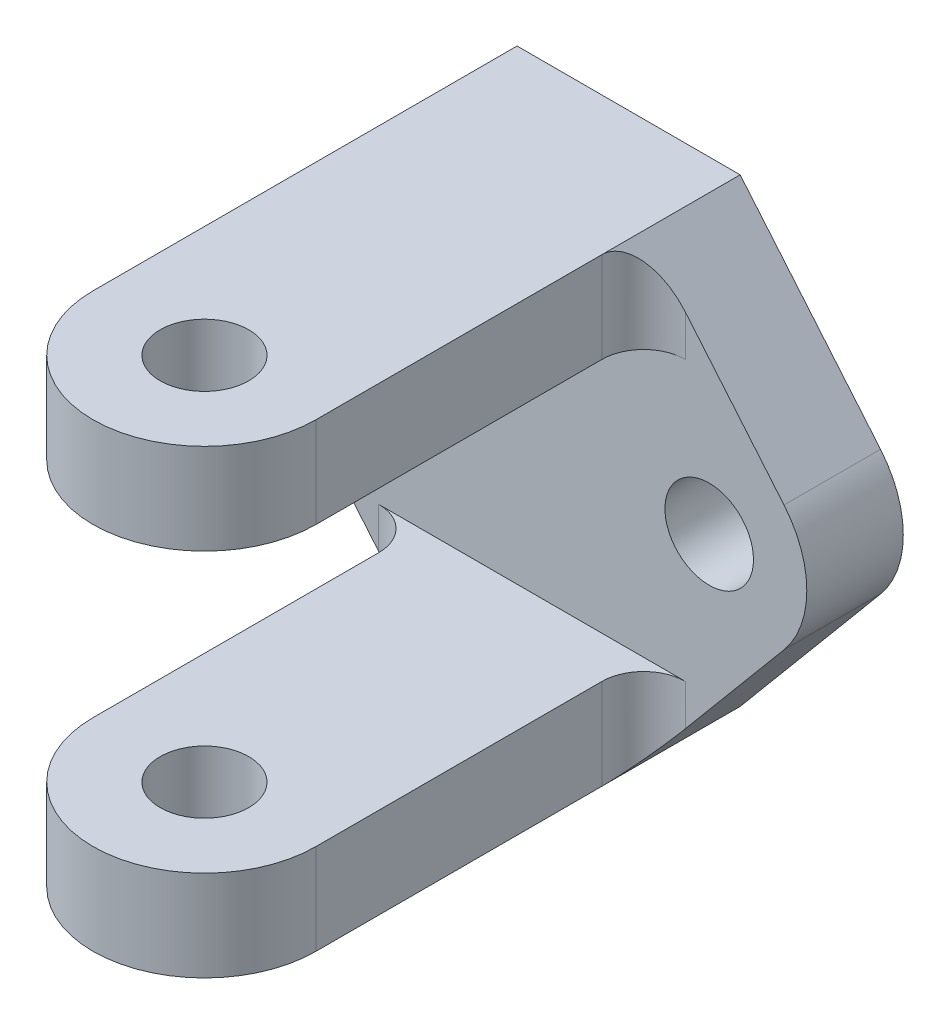
ISO-10303-21;
HEADER;
FILE_DESCRIPTION(('STEP AP214'),'2;1');
FILE_NAME('part.step','',(''),(''),'','','');
FILE_SCHEMA(('AUTOMOTIVE_DESIGN { 1 0 10303 214 1 1 1 1 }'));
ENDSEC;
DATA;
#1=APPLICATION_CONTEXT('core data for automotive mechanical design processes');
#2=APPLICATION_PROTOCOL_DEFINITION('international standard','automotive_design',2000,#1);
#3=PRODUCT_CONTEXT('',#1,'mechanical');
#4=PRODUCT('Part','Part','',(#3));
#5=PRODUCT_RELATED_PRODUCT_CATEGORY('part','',(#4));
#6=PRODUCT_DEFINITION_FORMATION('','',#4);
#7=PRODUCT_DEFINITION_CONTEXT('part definition',#1,'design');
#8=PRODUCT_DEFINITION('design','',#6,#7);
#9=PRODUCT_DEFINITION_SHAPE('','',#8);
#10=(LENGTH_UNIT() NAMED_UNIT(*) SI_UNIT(.MILLI.,.METRE.));
#11=(NAMED_UNIT(*) PLANE_ANGLE_UNIT() SI_UNIT($,.RADIAN.));
#12=(NAMED_UNIT(*) SI_UNIT($,.STERADIAN.) SOLID_ANGLE_UNIT());
#13=UNCERTAINTY_MEASURE_WITH_UNIT(LENGTH_MEASURE(1.E-05),#10,'distance_accuracy_value','');
#14=(GEOMETRIC_REPRESENTATION_CONTEXT(3) GLOBAL_UNCERTAINTY_ASSIGNED_CONTEXT((#13)) GLOBAL_UNIT_ASSIGNED_CONTEXT((#10,
#11,#12)) REPRESENTATION_CONTEXT('',''));
#15=CARTESIAN_POINT('',(0.,0.,0.));
#16=DIRECTION('',(0.,0.,1.));
#17=DIRECTION('',(1.,0.,0.));
#18=AXIS2_PLACEMENT_3D('',#15,#16,#17);
#19=CARTESIAN_POINT('',(-8.,-83.7629553253982,20.));
#20=DIRECTION('',(1.,0.,0.));
#21=DIRECTION('',(0.,0.,-1.));
#22=AXIS2_PLACEMENT_3D('',#19,#20,#21);
#23=PLANE('',#22);
#24=DIRECTION('',(0.,0.,1.));
#25=VECTOR('',#24,1.);
#26=CARTESIAN_POINT('',(-8.,16.51,20.));
#27=LINE('',#26,#25);
#28=CARTESIAN_POINT('',(-8.,16.51,15.));
#29=VERTEX_POINT('',#28);
#30=CARTESIAN_POINT('',(-8.,16.51,35.5));
#31=VERTEX_POINT('',#30);
#32=EDGE_CURVE('E221',#29,#31,#27,.T.);
#33=ORIENTED_EDGE('',*,*,#32,.F.);
#34=DIRECTION('',(0.,1.,0.));
#35=VECTOR('',#34,1.);
#36=CARTESIAN_POINT('',(-8.,9.99999999999999,15.));
#37=LINE('',#36,#35);
#38=CARTESIAN_POINT('',(-8.,10.,15.));
#39=VERTEX_POINT('',#38);
#40=EDGE_CURVE('E323',#29,#39,#37,.F.);
#41=ORIENTED_EDGE('',*,*,#40,.T.);
#42=DIRECTION('',(0.,0.,-1.));
#43=VECTOR('',#42,1.);
#44=CARTESIAN_POINT('',(-8.,10.,65.));
#45=LINE('',#44,#43);
#46=CARTESIAN_POINT('',(-8.,9.99999999999999,35.5));
#47=VERTEX_POINT('',#46);
#48=EDGE_CURVE('E263',#47,#39,#45,.T.);
#49=ORIENTED_EDGE('',*,*,#48,.F.);
#50=DIRECTION('',(0.,1.,0.));
#51=VECTOR('',#50,1.);
#52=CARTESIAN_POINT('',(-8.,-83.7629553253982,35.5));
#53=LINE('',#52,#51);
#54=EDGE_CURVE('E252',#47,#31,#53,.T.);
#55=ORIENTED_EDGE('',*,*,#54,.T.);
#56=EDGE_LOOP('',(#33,#41,#49,#55));
#57=FACE_BOUND('',#56,.T.);
#58=ADVANCED_FACE('F44',(#57),#23,.F.);
#59=CARTESIAN_POINT('',(8.,-83.7629553253982,35.5));
#60=DIRECTION('',(-1.,0.,0.));
#61=DIRECTION('',(0.,0.,1.));
#62=AXIS2_PLACEMENT_3D('',#59,#60,#61);
#63=PLANE('',#62);
#64=DIRECTION('',(0.,0.,1.));
#65=VECTOR('',#64,1.);
#66=CARTESIAN_POINT('',(8.,10.,65.));
#67=LINE('',#66,#65);
#68=CARTESIAN_POINT('',(8.,10.,15.));
#69=VERTEX_POINT('',#68);
#70=CARTESIAN_POINT('',(8.,9.99999999999999,35.5));
#71=VERTEX_POINT('',#70);
#72=EDGE_CURVE('E248',#69,#71,#67,.T.);
#73=ORIENTED_EDGE('',*,*,#72,.F.);
#74=DIRECTION('',(0.,1.,0.));
#75=VECTOR('',#74,1.);
#76=CARTESIAN_POINT('',(8.,16.51,15.));
#77=LINE('',#76,#75);
#78=CARTESIAN_POINT('',(8.,16.51,15.));
#79=VERTEX_POINT('',#78);
#80=EDGE_CURVE('E332',#69,#79,#77,.T.);
#81=ORIENTED_EDGE('',*,*,#80,.T.);
#82=DIRECTION('',(0.,0.,-1.));
#83=VECTOR('',#82,1.);
#84=CARTESIAN_POINT('',(8.,16.51,35.5));
#85=LINE('',#84,#83);
#86=CARTESIAN_POINT('',(8.,16.51,35.5));
#87=VERTEX_POINT('',#86);
#88=EDGE_CURVE('E232',#87,#79,#85,.T.);
#89=ORIENTED_EDGE('',*,*,#88,.F.);
#90=DIRECTION('',(0.,1.,0.));
#91=VECTOR('',#90,1.);
#92=CARTESIAN_POINT('',(8.,-83.7629553253982,35.5));
#93=LINE('',#92,#91);
#94=EDGE_CURVE('E236',#71,#87,#93,.T.);
#95=ORIENTED_EDGE('',*,*,#94,.F.);
#96=EDGE_LOOP('',(#73,#81,#89,#95));
#97=FACE_BOUND('',#96,.T.);
#98=ADVANCED_FACE('F381',(#97),#63,.F.);
#99=CARTESIAN_POINT('',(12.7,0.,47.3781062240477));
#100=DIRECTION('',(0.,0.,-1.));
#101=DIRECTION('',(-1.,0.,0.));
#102=AXIS2_PLACEMENT_3D('',#99,#100,#101);
#103=CYLINDRICAL_SURFACE('',#102,7.);
#104=CARTESIAN_POINT('',(12.7,0.,5.08));
#105=DIRECTION('',(0.,0.,1.));
#106=DIRECTION('',(1.,0.,0.));
#107=AXIS2_PLACEMENT_3D('',#104,#105,#106);
#108=CIRCLE('',#107,7.00000000000001);
#109=CARTESIAN_POINT('',(18.0657591468047,-4.49540084736414,5.08));
#110=VERTEX_POINT('',#109);
#111=CARTESIAN_POINT('',(18.0657591468047,4.49540084736415,5.08));
#112=VERTEX_POINT('',#111);
#113=EDGE_CURVE('E489',#110,#112,#108,.T.);
#114=ORIENTED_EDGE('',*,*,#113,.T.);
#115=DIRECTION('',(0.,0.,-1.));
#116=VECTOR('',#115,1.);
#117=CARTESIAN_POINT('',(18.0657591468047,4.49540084736414,27.6738667851937));
#118=LINE('',#117,#116);
#119=CARTESIAN_POINT('',(18.0657591468047,4.49540084736414,12.));
#120=VERTEX_POINT('',#119);
#121=EDGE_CURVE('E373',#120,#112,#118,.T.);
#122=ORIENTED_EDGE('',*,*,#121,.F.);
#123=CARTESIAN_POINT('',(12.7,0.,12.));
#124=DIRECTION('',(0.,0.,-1.));
#125=DIRECTION('',(-1.,0.,0.));
#126=AXIS2_PLACEMENT_3D('',#123,#124,#125);
#127=CIRCLE('',#126,7.);
#128=CARTESIAN_POINT('',(18.0657591468046,-4.49540084736413,12.));
#129=VERTEX_POINT('',#128);
#130=EDGE_CURVE('E213',#129,#120,#127,.F.);
#131=ORIENTED_EDGE('',*,*,#130,.F.);
#132=DIRECTION('',(0.,0.,-1.));
#133=VECTOR('',#132,1.);
#134=CARTESIAN_POINT('',(18.0657591468047,-4.49540084736414,27.6738667851937));
#135=LINE('',#134,#133);
#136=EDGE_CURVE('E204',#129,#110,#135,.T.);
#137=ORIENTED_EDGE('',*,*,#136,.T.);
#138=EDGE_LOOP('',(#114,#122,#131,#137));
#139=FACE_BOUND('',#138,.T.);
#140=ADVANCED_FACE('F417',(#139),#103,.T.);
#141=DIRECTION('',(0.,0.,1.));
#142=VECTOR('',#141,1.);
#143=CARTESIAN_POINT('',(-8.,-10.,65.));
#144=LINE('',#143,#142);
#145=CARTESIAN_POINT('',(-8.,-10.,15.));
#146=VERTEX_POINT('',#145);
#147=CARTESIAN_POINT('',(-8.,-9.99999999999999,35.5));
#148=VERTEX_POINT('',#147);
#149=EDGE_CURVE('E304',#146,#148,#144,.T.);
#150=ORIENTED_EDGE('',*,*,#149,.F.);
#151=DIRECTION('',(0.,-1.,0.));
#152=VECTOR('',#151,1.);
#153=CARTESIAN_POINT('',(-8.,-16.51,15.));
#154=LINE('',#153,#152);
#155=CARTESIAN_POINT('',(-8.,-16.51,15.));
#156=VERTEX_POINT('',#155);
#157=EDGE_CURVE('E326',#146,#156,#154,.T.);
#158=ORIENTED_EDGE('',*,*,#157,.T.);
#159=DIRECTION('',(0.,0.,1.));
#160=VECTOR('',#159,1.);
#161=CARTESIAN_POINT('',(-8.,-16.51,20.));
#162=LINE('',#161,#160);
#163=CARTESIAN_POINT('',(-8.,-16.51,35.5));
#164=VERTEX_POINT('',#163);
#165=EDGE_CURVE('E244',#156,#164,#162,.T.);
#166=ORIENTED_EDGE('',*,*,#165,.T.);
#167=EDGE_CURVE('E241',#164,#148,#53,.T.);
#168=ORIENTED_EDGE('',*,*,#167,.T.);
#169=EDGE_LOOP('',(#150,#158,#166,#168));
#170=FACE_BOUND('',#169,.T.);
#171=ADVANCED_FACE('F413',(#170),#23,.F.);
#172=CARTESIAN_POINT('',(-12.7,0.,47.3781062240477));
#173=DIRECTION('',(0.,0.,-1.));
#174=DIRECTION('',(-1.,0.,0.));
#175=AXIS2_PLACEMENT_3D('',#172,#173,#174);
#176=CYLINDRICAL_SURFACE('',#175,7.);
#177=DIRECTION('',(0.,0.,-1.));
#178=VECTOR('',#177,1.);
#179=CARTESIAN_POINT('',(-18.0657591468047,4.49540084736414,27.6738667851937));
#180=LINE('',#179,#178);
#181=CARTESIAN_POINT('',(-18.0657591468047,4.49540084736414,12.));
#182=VERTEX_POINT('',#181);
#183=CARTESIAN_POINT('',(-18.0657591468047,4.49540084736414,5.08000000000001));
#184=VERTEX_POINT('',#183);
#185=EDGE_CURVE('E193',#182,#184,#180,.T.);
#186=ORIENTED_EDGE('',*,*,#185,.T.);
#187=CARTESIAN_POINT('',(-12.7,0.,5.08));
#188=DIRECTION('',(0.,0.,1.));
#189=DIRECTION('',(1.,0.,0.));
#190=AXIS2_PLACEMENT_3D('',#187,#188,#189);
#191=CIRCLE('',#190,7.);
#192=CARTESIAN_POINT('',(-18.0657591468046,-4.49540084736414,5.08));
#193=VERTEX_POINT('',#192);
#194=EDGE_CURVE('E60',#184,#193,#191,.T.);
#195=ORIENTED_EDGE('',*,*,#194,.T.);
#196=DIRECTION('',(0.,0.,-1.));
#197=VECTOR('',#196,1.);
#198=CARTESIAN_POINT('',(-18.0657591468046,-4.49540084736414,27.6738667851937));
#199=LINE('',#198,#197);
#200=CARTESIAN_POINT('',(-18.0657591468047,-4.49540084736414,12.));
#201=VERTEX_POINT('',#200);
#202=EDGE_CURVE('E190',#201,#193,#199,.T.);
#203=ORIENTED_EDGE('',*,*,#202,.F.);
#204=CARTESIAN_POINT('',(-12.7,0.,12.));
#205=DIRECTION('',(0.,0.,-1.));
#206=DIRECTION('',(-1.,0.,0.));
#207=AXIS2_PLACEMENT_3D('',#204,#205,#206);
#208=CIRCLE('',#207,7.);
#209=EDGE_CURVE('E218',#201,#182,#208,.T.);
#210=ORIENTED_EDGE('',*,*,#209,.T.);
#211=EDGE_LOOP('',(#186,#195,#203,#210));
#212=FACE_BOUND('',#211,.T.);
#213=ADVANCED_FACE('F188',(#212),#176,.T.);
#214=DIRECTION('',(0.,0.,-1.));
#215=VECTOR('',#214,1.);
#216=CARTESIAN_POINT('',(8.,-16.51,35.5));
#217=LINE('',#216,#215);
#218=CARTESIAN_POINT('',(8.,-16.51,35.5));
#219=VERTEX_POINT('',#218);
#220=CARTESIAN_POINT('',(8.,-16.51,15.));
#221=VERTEX_POINT('',#220);
#222=EDGE_CURVE('E237',#219,#221,#217,.T.);
#223=ORIENTED_EDGE('',*,*,#222,.T.);
#224=DIRECTION('',(0.,-1.,0.));
#225=VECTOR('',#224,1.);
#226=CARTESIAN_POINT('',(8.,-9.99999999999999,15.));
#227=LINE('',#226,#225);
#228=CARTESIAN_POINT('',(8.,-9.99999999999999,15.));
#229=VERTEX_POINT('',#228);
#230=EDGE_CURVE('E92',#221,#229,#227,.F.);
#231=ORIENTED_EDGE('',*,*,#230,.T.);
#232=DIRECTION('',(0.,0.,-1.));
#233=VECTOR('',#232,1.);
#234=CARTESIAN_POINT('',(8.,-9.99999999999999,65.));
#235=LINE('',#234,#233);
#236=CARTESIAN_POINT('',(8.,-9.99999999999999,35.5));
#237=VERTEX_POINT('',#236);
#238=EDGE_CURVE('E294',#237,#229,#235,.T.);
#239=ORIENTED_EDGE('',*,*,#238,.F.);
#240=EDGE_CURVE('E253',#219,#237,#93,.T.);
#241=ORIENTED_EDGE('',*,*,#240,.F.);
#242=EDGE_LOOP('',(#223,#231,#239,#241));
#243=FACE_BOUND('',#242,.T.);
#244=ADVANCED_FACE('F418',(#243),#63,.F.);
#245=CARTESIAN_POINT('',(0.,0.,12.));
#246=DIRECTION('',(0.,0.,-1.));
#247=DIRECTION('',(-1.,0.,0.));
#248=AXIS2_PLACEMENT_3D('',#245,#246,#247);
#249=PLANE('',#248);
#250=DIRECTION('',(1.,0.,0.));
#251=VECTOR('',#250,1.);
#252=CARTESIAN_POINT('',(-20.7,10.,12.));
#253=LINE('',#252,#251);
#254=CARTESIAN_POINT('',(-11.,10.,12.));
#255=VERTEX_POINT('',#254);
#256=CARTESIAN_POINT('',(11.,10.,12.));
#257=VERTEX_POINT('',#256);
#258=EDGE_CURVE('E283',#255,#257,#253,.T.);
#259=ORIENTED_EDGE('',*,*,#258,.F.);
#260=DIRECTION('',(0.,1.,0.));
#261=VECTOR('',#260,1.);
#262=CARTESIAN_POINT('',(-11.,16.51,12.));
#263=LINE('',#262,#261);
#264=CARTESIAN_POINT('',(-11.,12.9291675031933,12.));
#265=VERTEX_POINT('',#264);
#266=EDGE_CURVE('E319',#255,#265,#263,.T.);
#267=ORIENTED_EDGE('',*,*,#266,.T.);
#268=DIRECTION('',(0.64220012105202,0.766537020972093,0.));
#269=VECTOR('',#268,1.);
#270=CARTESIAN_POINT('',(-8.,16.51,12.));
#271=LINE('',#270,#269);
#272=EDGE_CURVE('E442',#182,#265,#271,.T.);
#273=ORIENTED_EDGE('',*,*,#272,.F.);
#274=ORIENTED_EDGE('',*,*,#209,.F.);
#275=DIRECTION('',(0.64220012105202,-0.766537020972093,0.));
#276=VECTOR('',#275,1.);
#277=CARTESIAN_POINT('',(-12.8280125042184,-10.7472319766351,12.));
#278=LINE('',#277,#276);
#279=CARTESIAN_POINT('',(-11.,-12.9291675031933,12.));
#280=VERTEX_POINT('',#279);
#281=EDGE_CURVE('E199',#201,#280,#278,.T.);
#282=ORIENTED_EDGE('',*,*,#281,.T.);
#283=DIRECTION('',(0.,-1.,0.));
#284=VECTOR('',#283,1.);
#285=CARTESIAN_POINT('',(-11.,-9.99999999999999,12.));
#286=LINE('',#285,#284);
#287=CARTESIAN_POINT('',(-11.,-10.,12.));
#288=VERTEX_POINT('',#287);
#289=EDGE_CURVE('E315',#280,#288,#286,.F.);
#290=ORIENTED_EDGE('',*,*,#289,.T.);
#291=DIRECTION('',(-1.,0.,0.));
#292=VECTOR('',#291,1.);
#293=CARTESIAN_POINT('',(-20.7,-10.,12.));
#294=LINE('',#293,#292);
#295=CARTESIAN_POINT('',(11.,-9.99999999999999,12.));
#296=VERTEX_POINT('',#295);
#297=EDGE_CURVE('E280',#296,#288,#294,.T.);
#298=ORIENTED_EDGE('',*,*,#297,.F.);
#299=DIRECTION('',(0.,-1.,0.));
#300=VECTOR('',#299,1.);
#301=CARTESIAN_POINT('',(11.,-16.51,12.));
#302=LINE('',#301,#300);
#303=CARTESIAN_POINT('',(11.,-12.9291675031933,12.));
#304=VERTEX_POINT('',#303);
#305=EDGE_CURVE('E311',#296,#304,#302,.T.);
#306=ORIENTED_EDGE('',*,*,#305,.T.);
#307=DIRECTION('',(-0.64220012105202,-0.766537020972093,0.));
#308=VECTOR('',#307,1.);
#309=CARTESIAN_POINT('',(12.8280125042185,-10.7472319766351,12.));
#310=LINE('',#309,#308);
#311=EDGE_CURVE('E210',#129,#304,#310,.T.);
#312=ORIENTED_EDGE('',*,*,#311,.F.);
#313=ORIENTED_EDGE('',*,*,#130,.T.);
#314=DIRECTION('',(-0.64220012105202,0.766537020972093,0.));
#315=VECTOR('',#314,1.);
#316=CARTESIAN_POINT('',(8.,16.51,12.));
#317=LINE('',#316,#315);
#318=CARTESIAN_POINT('',(11.,12.9291675031933,12.));
#319=VERTEX_POINT('',#318);
#320=EDGE_CURVE('E362',#120,#319,#317,.T.);
#321=ORIENTED_EDGE('',*,*,#320,.T.);
#322=DIRECTION('',(0.,1.,0.));
#323=VECTOR('',#322,1.);
#324=CARTESIAN_POINT('',(11.,9.99999999999999,12.));
#325=LINE('',#324,#323);
#326=EDGE_CURVE('E307',#319,#257,#325,.F.);
#327=ORIENTED_EDGE('',*,*,#326,.T.);
#328=EDGE_LOOP('',(#259,#267,#273,#274,#282,#290,#298,#306,#312,#313,#321,#327));
#329=FACE_BOUND('',#328,.T.);
#330=CARTESIAN_POINT('',(-12.7,0.,12.));
#331=DIRECTION('',(0.,0.,1.));
#332=DIRECTION('',(1.,0.,0.));
#333=AXIS2_PLACEMENT_3D('',#330,#331,#332);
#334=CIRCLE('',#333,3.175);
#335=CARTESIAN_POINT('',(-9.525,0.,12.));
#336=VERTEX_POINT('',#335);
#337=EDGE_CURVE('E286',#336,#336,#334,.T.);
#338=ORIENTED_EDGE('',*,*,#337,.F.);
#339=EDGE_LOOP('',(#338));
#340=FACE_BOUND('',#339,.T.);
#341=CARTESIAN_POINT('',(12.7,0.,12.));
#342=DIRECTION('',(0.,0.,1.));
#343=DIRECTION('',(1.,0.,0.));
#344=AXIS2_PLACEMENT_3D('',#341,#342,#343);
#345=CIRCLE('',#344,3.175);
#346=CARTESIAN_POINT('',(15.875,0.,12.));
#347=VERTEX_POINT('',#346);
#348=EDGE_CURVE('E290',#347,#347,#345,.T.);
#349=ORIENTED_EDGE('',*,*,#348,.F.);
#350=EDGE_LOOP('',(#349));
#351=FACE_BOUND('',#350,.T.);
#352=ADVANCED_FACE('F367',(#329,#340,#351),#249,.F.);
#353=CARTESIAN_POINT('',(-20.7,16.51,12.));
#354=DIRECTION('',(0.,-1.,0.));
#355=DIRECTION('',(0.,0.,-1.));
#356=AXIS2_PLACEMENT_3D('',#353,#354,#355);
#357=PLANE('',#356);
#358=CARTESIAN_POINT('',(0.,16.51,35.5));
#359=DIRECTION('',(0.,-1.,0.));
#360=DIRECTION('',(0.,0.,-1.));
#361=AXIS2_PLACEMENT_3D('',#358,#359,#360);
#362=CIRCLE('',#361,3.175);
#363=CARTESIAN_POINT('',(0.,16.51,38.675));
#364=VERTEX_POINT('',#363);
#365=EDGE_CURVE('E267',#364,#364,#362,.T.);
#366=ORIENTED_EDGE('',*,*,#365,.T.);
#367=EDGE_LOOP('',(#366));
#368=FACE_BOUND('',#367,.T.);
#369=DIRECTION('',(0.,0.,-1.));
#370=VECTOR('',#369,1.);
#371=CARTESIAN_POINT('',(8.,16.51,27.6738667851937));
#372=LINE('',#371,#370);
#373=CARTESIAN_POINT('',(8.,16.51,5.08));
#374=VERTEX_POINT('',#373);
#375=EDGE_CURVE('E83',#79,#374,#372,.T.);
#376=ORIENTED_EDGE('',*,*,#375,.T.);
#377=DIRECTION('',(-1.,0.,0.));
#378=VECTOR('',#377,1.);
#379=CARTESIAN_POINT('',(8.,16.51,5.08));
#380=LINE('',#379,#378);
#381=CARTESIAN_POINT('',(-8.,16.51,5.08));
#382=VERTEX_POINT('',#381);
#383=EDGE_CURVE('E456',#374,#382,#380,.T.);
#384=ORIENTED_EDGE('',*,*,#383,.T.);
#385=EDGE_CURVE('E225',#382,#29,#27,.T.);
#386=ORIENTED_EDGE('',*,*,#385,.T.);
#387=ORIENTED_EDGE('',*,*,#32,.T.);
#388=CARTESIAN_POINT('',(0.,16.51,35.5));
#389=DIRECTION('',(0.,-1.,0.));
#390=DIRECTION('',(0.,0.,-1.));
#391=AXIS2_PLACEMENT_3D('',#388,#389,#390);
#392=CIRCLE('',#391,8.);
#393=EDGE_CURVE('E228',#31,#87,#392,.F.);
#394=ORIENTED_EDGE('',*,*,#393,.T.);
#395=ORIENTED_EDGE('',*,*,#88,.T.);
#396=EDGE_LOOP('',(#376,#384,#386,#387,#394,#395));
#397=FACE_BOUND('',#396,.T.);
#398=ADVANCED_FACE('F391',(#368,#397),#357,.F.);
#399=CARTESIAN_POINT('',(-20.7,-16.51,12.));
#400=DIRECTION('',(0.,1.,0.));
#401=DIRECTION('',(0.,0.,1.));
#402=AXIS2_PLACEMENT_3D('',#399,#400,#401);
#403=PLANE('',#402);
#404=CARTESIAN_POINT('',(0.,-16.51,35.5));
#405=DIRECTION('',(0.,1.,0.));
#406=DIRECTION('',(0.,0.,1.));
#407=AXIS2_PLACEMENT_3D('',#404,#405,#406);
#408=CIRCLE('',#407,3.175);
#409=CARTESIAN_POINT('',(0.,-16.51,38.675));
#410=VERTEX_POINT('',#409);
#411=EDGE_CURVE('E271',#410,#410,#408,.F.);
#412=ORIENTED_EDGE('',*,*,#411,.F.);
#413=EDGE_LOOP('',(#412));
#414=FACE_BOUND('',#413,.T.);
#415=CARTESIAN_POINT('',(-8.,-16.51,5.08));
#416=VERTEX_POINT('',#415);
#417=EDGE_CURVE('E245',#416,#156,#162,.T.);
#418=ORIENTED_EDGE('',*,*,#417,.F.);
#419=DIRECTION('',(1.,0.,0.));
#420=VECTOR('',#419,1.);
#421=CARTESIAN_POINT('',(-8.,-16.51,5.08));
#422=LINE('',#421,#420);
#423=CARTESIAN_POINT('',(8.,-16.51,5.08));
#424=VERTEX_POINT('',#423);
#425=EDGE_CURVE('E179',#416,#424,#422,.T.);
#426=ORIENTED_EDGE('',*,*,#425,.T.);
#427=DIRECTION('',(0.,0.,-1.));
#428=VECTOR('',#427,1.);
#429=CARTESIAN_POINT('',(8.,-16.51,27.6738667851937));
#430=LINE('',#429,#428);
#431=EDGE_CURVE('E69',#221,#424,#430,.T.);
#432=ORIENTED_EDGE('',*,*,#431,.F.);
#433=ORIENTED_EDGE('',*,*,#222,.F.);
#434=CARTESIAN_POINT('',(0.,-16.51,35.5));
#435=DIRECTION('',(0.,1.,0.));
#436=DIRECTION('',(0.,0.,1.));
#437=AXIS2_PLACEMENT_3D('',#434,#435,#436);
#438=CIRCLE('',#437,8.);
#439=EDGE_CURVE('E240',#164,#219,#438,.T.);
#440=ORIENTED_EDGE('',*,*,#439,.F.);
#441=ORIENTED_EDGE('',*,*,#165,.F.);
#442=EDGE_LOOP('',(#418,#426,#432,#433,#440,#441));
#443=FACE_BOUND('',#442,.T.);
#444=ADVANCED_FACE('F486',(#414,#443),#403,.F.);
#445=CARTESIAN_POINT('',(12.7,0.,12.));
#446=DIRECTION('',(0.,0.,-1.));
#447=DIRECTION('',(-1.,0.,0.));
#448=AXIS2_PLACEMENT_3D('',#445,#446,#447);
#449=CYLINDRICAL_SURFACE('',#448,3.175);
#450=CARTESIAN_POINT('',(12.7,0.,5.08));
#451=DIRECTION('',(0.,0.,1.));
#452=DIRECTION('',(1.,0.,0.));
#453=AXIS2_PLACEMENT_3D('',#450,#451,#452);
#454=CIRCLE('',#453,3.175);
#455=CARTESIAN_POINT('',(15.875,0.,5.08));
#456=VERTEX_POINT('',#455);
#457=EDGE_CURVE('E446',#456,#456,#454,.T.);
#458=ORIENTED_EDGE('',*,*,#457,.F.);
#459=EDGE_LOOP('',(#458));
#460=FACE_BOUND('',#459,.T.);
#461=ORIENTED_EDGE('',*,*,#348,.T.);
#462=EDGE_LOOP('',(#461));
#463=FACE_BOUND('',#462,.T.);
#464=ADVANCED_FACE('F510',(#460,#463),#449,.F.);
#465=CARTESIAN_POINT('',(-12.7,0.,12.));
#466=DIRECTION('',(0.,0.,-1.));
#467=DIRECTION('',(-1.,0.,0.));
#468=AXIS2_PLACEMENT_3D('',#465,#466,#467);
#469=CYLINDRICAL_SURFACE('',#468,3.175);
#470=CARTESIAN_POINT('',(-12.7,0.,5.08));
#471=DIRECTION('',(0.,0.,1.));
#472=DIRECTION('',(1.,0.,0.));
#473=AXIS2_PLACEMENT_3D('',#470,#471,#472);
#474=CIRCLE('',#473,3.175);
#475=CARTESIAN_POINT('',(-9.525,0.,5.08));
#476=VERTEX_POINT('',#475);
#477=EDGE_CURVE('E500',#476,#476,#474,.T.);
#478=ORIENTED_EDGE('',*,*,#477,.F.);
#479=EDGE_LOOP('',(#478));
#480=FACE_BOUND('',#479,.T.);
#481=ORIENTED_EDGE('',*,*,#337,.T.);
#482=EDGE_LOOP('',(#481));
#483=FACE_BOUND('',#482,.T.);
#484=ADVANCED_FACE('F513',(#480,#483),#469,.F.);
#485=CARTESIAN_POINT('',(-20.7,10.,65.));
#486=DIRECTION('',(0.,1.,0.));
#487=DIRECTION('',(0.,0.,1.));
#488=AXIS2_PLACEMENT_3D('',#485,#486,#487);
#489=PLANE('',#488);
#490=CARTESIAN_POINT('',(0.,10.,35.5));
#491=DIRECTION('',(0.,1.,0.));
#492=DIRECTION('',(0.,0.,1.));
#493=AXIS2_PLACEMENT_3D('',#490,#491,#492);
#494=CIRCLE('',#493,3.175);
#495=CARTESIAN_POINT('',(0.,10.,38.675));
#496=VERTEX_POINT('',#495);
#497=EDGE_CURVE('E276',#496,#496,#494,.T.);
#498=ORIENTED_EDGE('',*,*,#497,.T.);
#499=EDGE_LOOP('',(#498));
#500=FACE_BOUND('',#499,.T.);
#501=CARTESIAN_POINT('',(0.,9.99999999999999,35.5));
#502=DIRECTION('',(0.,1.,0.));
#503=DIRECTION('',(0.,0.,1.));
#504=AXIS2_PLACEMENT_3D('',#501,#502,#503);
#505=CIRCLE('',#504,8.);
#506=EDGE_CURVE('E259',#71,#47,#505,.F.);
#507=ORIENTED_EDGE('',*,*,#506,.T.);
#508=ORIENTED_EDGE('',*,*,#48,.T.);
#509=CARTESIAN_POINT('',(-11.,10.,15.));
#510=DIRECTION('',(0.,1.,0.));
#511=DIRECTION('',(0.,0.,1.));
#512=AXIS2_PLACEMENT_3D('',#509,#510,#511);
#513=CIRCLE('',#512,3.);
#514=EDGE_CURVE('E340',#39,#255,#513,.T.);
#515=ORIENTED_EDGE('',*,*,#514,.T.);
#516=ORIENTED_EDGE('',*,*,#258,.T.);
#517=CARTESIAN_POINT('',(11.,9.99999999999999,15.));
#518=DIRECTION('',(0.,1.,0.));
#519=DIRECTION('',(0.,0.,1.));
#520=AXIS2_PLACEMENT_3D('',#517,#518,#519);
#521=CIRCLE('',#520,3.);
#522=EDGE_CURVE('E11',#257,#69,#521,.T.);
#523=ORIENTED_EDGE('',*,*,#522,.T.);
#524=ORIENTED_EDGE('',*,*,#72,.T.);
#525=EDGE_LOOP('',(#507,#508,#515,#516,#523,#524));
#526=FACE_BOUND('',#525,.T.);
#527=ADVANCED_FACE('F377',(#500,#526),#489,.F.);
#528=CARTESIAN_POINT('',(-20.7,-10.,65.));
#529=DIRECTION('',(0.,-1.,0.));
#530=DIRECTION('',(1.,0.,0.));
#531=AXIS2_PLACEMENT_3D('',#528,#529,#530);
#532=PLANE('',#531);
#533=CARTESIAN_POINT('',(0.,-9.99999999999999,35.5));
#534=DIRECTION('',(0.,-1.,0.));
#535=DIRECTION('',(1.,0.,0.));
#536=AXIS2_PLACEMENT_3D('',#533,#534,#535);
#537=CIRCLE('',#536,3.175);
#538=CARTESIAN_POINT('',(0.,-9.99999999999999,38.675));
#539=VERTEX_POINT('',#538);
#540=EDGE_CURVE('E275',#539,#539,#537,.T.);
#541=ORIENTED_EDGE('',*,*,#540,.T.);
#542=EDGE_LOOP('',(#541));
#543=FACE_BOUND('',#542,.T.);
#544=ORIENTED_EDGE('',*,*,#297,.T.);
#545=CARTESIAN_POINT('',(-11.,-10.,15.));
#546=DIRECTION('',(0.,-1.,0.));
#547=DIRECTION('',(1.,0.,0.));
#548=AXIS2_PLACEMENT_3D('',#545,#546,#547);
#549=CIRCLE('',#548,3.);
#550=EDGE_CURVE('E347',#288,#146,#549,.T.);
#551=ORIENTED_EDGE('',*,*,#550,.T.);
#552=ORIENTED_EDGE('',*,*,#149,.T.);
#553=CARTESIAN_POINT('',(0.,-9.99999999999999,35.5));
#554=DIRECTION('',(0.,-1.,0.));
#555=DIRECTION('',(1.,0.,0.));
#556=AXIS2_PLACEMENT_3D('',#553,#554,#555);
#557=CIRCLE('',#556,8.);
#558=EDGE_CURVE('E300',#148,#237,#557,.F.);
#559=ORIENTED_EDGE('',*,*,#558,.T.);
#560=ORIENTED_EDGE('',*,*,#238,.T.);
#561=CARTESIAN_POINT('',(11.,-9.99999999999999,15.));
#562=DIRECTION('',(0.,-1.,0.));
#563=DIRECTION('',(1.,0.,0.));
#564=AXIS2_PLACEMENT_3D('',#561,#562,#563);
#565=CIRCLE('',#564,3.);
#566=EDGE_CURVE('E354',#229,#296,#565,.T.);
#567=ORIENTED_EDGE('',*,*,#566,.T.);
#568=EDGE_LOOP('',(#544,#551,#552,#559,#560,#567));
#569=FACE_BOUND('',#568,.T.);
#570=ADVANCED_FACE('F483',(#543,#569),#532,.F.);
#571=CARTESIAN_POINT('',(0.,-25.4902561210691,35.5));
#572=DIRECTION('',(0.,1.,0.));
#573=DIRECTION('',(0.,0.,1.));
#574=AXIS2_PLACEMENT_3D('',#571,#572,#573);
#575=CYLINDRICAL_SURFACE('',#574,3.175);
#576=CARTESIAN_POINT('',(0.,-16.51,38.675));
#577=CARTESIAN_POINT('',(0.,-16.4421875,38.675));
#578=CARTESIAN_POINT('',(0.,-16.374375,38.675));
#579=CARTESIAN_POINT('',(0.,-16.23875,38.675));
#580=CARTESIAN_POINT('',(0.,-16.1709375,38.675));
#581=CARTESIAN_POINT('',(0.,-16.0353125,38.675));
#582=CARTESIAN_POINT('',(0.,-15.9675,38.675));
#583=CARTESIAN_POINT('',(0.,-15.831875,38.675));
#584=CARTESIAN_POINT('',(0.,-15.7640625,38.675));
#585=CARTESIAN_POINT('',(0.,-15.6284375,38.675));
#586=CARTESIAN_POINT('',(0.,-15.560625,38.675));
#587=CARTESIAN_POINT('',(0.,-15.425,38.675));
#588=CARTESIAN_POINT('',(0.,-15.3571875,38.675));
#589=CARTESIAN_POINT('',(0.,-15.2215625,38.675));
#590=CARTESIAN_POINT('',(0.,-15.15375,38.675));
#591=CARTESIAN_POINT('',(0.,-15.018125,38.675));
#592=CARTESIAN_POINT('',(0.,-14.9503125,38.675));
#593=CARTESIAN_POINT('',(0.,-14.8146875,38.675));
#594=CARTESIAN_POINT('',(0.,-14.746875,38.675));
#595=CARTESIAN_POINT('',(0.,-14.61125,38.675));
#596=CARTESIAN_POINT('',(0.,-14.5434375,38.675));
#597=CARTESIAN_POINT('',(0.,-14.4078125,38.675));
#598=CARTESIAN_POINT('',(0.,-14.34,38.675));
#599=CARTESIAN_POINT('',(0.,-14.204375,38.675));
#600=CARTESIAN_POINT('',(0.,-14.1365625,38.675));
#601=CARTESIAN_POINT('',(0.,-14.0009375,38.675));
#602=CARTESIAN_POINT('',(0.,-13.933125,38.675));
#603=CARTESIAN_POINT('',(0.,-13.7975,38.675));
#604=CARTESIAN_POINT('',(0.,-13.7296875,38.675));
#605=CARTESIAN_POINT('',(0.,-13.5940625,38.675));
#606=CARTESIAN_POINT('',(0.,-13.52625,38.675));
#607=CARTESIAN_POINT('',(0.,-13.390625,38.675));
#608=CARTESIAN_POINT('',(0.,-13.3228125,38.675));
#609=CARTESIAN_POINT('',(0.,-13.1871875,38.675));
#610=CARTESIAN_POINT('',(0.,-13.119375,38.675));
#611=CARTESIAN_POINT('',(0.,-12.98375,38.675));
#612=CARTESIAN_POINT('',(0.,-12.9159375,38.675));
#613=CARTESIAN_POINT('',(0.,-12.7803125,38.675));
#614=CARTESIAN_POINT('',(0.,-12.7125,38.675));
#615=CARTESIAN_POINT('',(0.,-12.576875,38.675));
#616=CARTESIAN_POINT('',(0.,-12.5090625,38.675));
#617=CARTESIAN_POINT('',(0.,-12.3734375,38.675));
#618=CARTESIAN_POINT('',(0.,-12.305625,38.675));
#619=CARTESIAN_POINT('',(0.,-12.17,38.675));
#620=CARTESIAN_POINT('',(0.,-12.1021875,38.675));
#621=CARTESIAN_POINT('',(0.,-11.9665625,38.675));
#622=CARTESIAN_POINT('',(0.,-11.89875,38.675));
#623=CARTESIAN_POINT('',(0.,-11.763125,38.675));
#624=CARTESIAN_POINT('',(0.,-11.6953125,38.675));
#625=CARTESIAN_POINT('',(0.,-11.5596875,38.675));
#626=CARTESIAN_POINT('',(0.,-11.491875,38.675));
#627=CARTESIAN_POINT('',(0.,-11.35625,38.675));
#628=CARTESIAN_POINT('',(0.,-11.2884375,38.675));
#629=CARTESIAN_POINT('',(0.,-11.1528125,38.675));
#630=CARTESIAN_POINT('',(0.,-11.085,38.675));
#631=CARTESIAN_POINT('',(0.,-10.949375,38.675));
#632=CARTESIAN_POINT('',(0.,-10.8815625,38.675));
#633=CARTESIAN_POINT('',(0.,-10.7459375,38.675));
#634=CARTESIAN_POINT('',(0.,-10.678125,38.675));
#635=CARTESIAN_POINT('',(0.,-10.5425,38.675));
#636=CARTESIAN_POINT('',(0.,-10.4746875,38.675));
#637=CARTESIAN_POINT('',(0.,-10.3390625,38.675));
#638=CARTESIAN_POINT('',(0.,-10.27125,38.675));
#639=CARTESIAN_POINT('',(0.,-10.135625,38.675));
#640=CARTESIAN_POINT('',(0.,-10.0678125,38.675));
#641=CARTESIAN_POINT('',(0.,-9.99999999999999,38.675));
#642=B_SPLINE_CURVE_WITH_KNOTS('',3,(#576,#577,#578,#579,#580,#581,#582,#583,#584,#585,#586,
#587,#588,#589,#590,#591,#592,#593,#594,#595,#596,#597,#598,#599,#600,#601,#602,#603,#604,#605,
#606,#607,#608,#609,#610,#611,#612,#613,#614,#615,#616,#617,#618,#619,#620,#621,#622,#623,#624,
#625,#626,#627,#628,#629,#630,#631,#632,#633,#634,#635,#636,#637,#638,#639,#640,#641),
.UNSPECIFIED.,.F.,.F.,(4,2,2,2,2,2,2,2,2,2,2,2,2,2,2,2,2,2,2,2,2,2,2,2,2,2,2,2,2,2,2,2,4),(0.,
0.2034375,0.406875000000001,0.610312500000001,0.813750000000002,1.0171875,1.220625,1.4240625,
1.6275,1.8309375,2.03437500000001,2.2378125,2.44125,2.6446875,2.84812500000001,3.05156250000001,
3.25500000000001,3.45843750000001,3.66187500000001,3.86531250000001,4.06875000000001,
4.27218750000001,4.47562500000001,4.67906250000001,4.88250000000001,5.08593750000001,
5.28937500000001,5.49281250000001,5.69625000000001,5.89968750000001,6.10312500000001,
6.30656250000001,6.51000000000001),.UNSPECIFIED.);
#643=EDGE_CURVE('BSEAM532',#410,#539,#642,.T.);
#644=ORIENTED_EDGE('',*,*,#411,.T.);
#645=ORIENTED_EDGE('',*,*,#540,.F.);
#646=ORIENTED_EDGE('',*,*,#643,.T.);
#647=ORIENTED_EDGE('',*,*,#643,.F.);
#648=EDGE_LOOP('',(#644,#646,#645,#647));
#649=FACE_BOUND('',#648,.T.);
#650=ADVANCED_FACE('F532',(#649),#575,.F.);
#651=CARTESIAN_POINT('',(0.,16.51,38.675));
#652=CARTESIAN_POINT('',(0.,16.4421875,38.675));
#653=CARTESIAN_POINT('',(0.,16.374375,38.675));
#654=CARTESIAN_POINT('',(0.,16.23875,38.675));
#655=CARTESIAN_POINT('',(0.,16.1709375,38.675));
#656=CARTESIAN_POINT('',(0.,16.0353125,38.675));
#657=CARTESIAN_POINT('',(0.,15.9675,38.675));
#658=CARTESIAN_POINT('',(0.,15.831875,38.675));
#659=CARTESIAN_POINT('',(0.,15.7640625,38.675));
#660=CARTESIAN_POINT('',(0.,15.6284375,38.675));
#661=CARTESIAN_POINT('',(0.,15.560625,38.675));
#662=CARTESIAN_POINT('',(0.,15.425,38.675));
#663=CARTESIAN_POINT('',(0.,15.3571875,38.675));
#664=CARTESIAN_POINT('',(0.,15.2215625,38.675));
#665=CARTESIAN_POINT('',(0.,15.15375,38.675));
#666=CARTESIAN_POINT('',(0.,15.018125,38.675));
#667=CARTESIAN_POINT('',(0.,14.9503125,38.675));
#668=CARTESIAN_POINT('',(0.,14.8146875,38.675));
#669=CARTESIAN_POINT('',(0.,14.746875,38.675));
#670=CARTESIAN_POINT('',(0.,14.61125,38.675));
#671=CARTESIAN_POINT('',(0.,14.5434375,38.675));
#672=CARTESIAN_POINT('',(0.,14.4078125,38.675));
#673=CARTESIAN_POINT('',(0.,14.34,38.675));
#674=CARTESIAN_POINT('',(0.,14.204375,38.675));
#675=CARTESIAN_POINT('',(0.,14.1365625,38.675));
#676=CARTESIAN_POINT('',(0.,14.0009375,38.675));
#677=CARTESIAN_POINT('',(0.,13.933125,38.675));
#678=CARTESIAN_POINT('',(0.,13.7975,38.675));
#679=CARTESIAN_POINT('',(0.,13.7296875,38.675));
#680=CARTESIAN_POINT('',(0.,13.5940625,38.675));
#681=CARTESIAN_POINT('',(0.,13.52625,38.675));
#682=CARTESIAN_POINT('',(0.,13.390625,38.675));
#683=CARTESIAN_POINT('',(0.,13.3228125,38.675));
#684=CARTESIAN_POINT('',(0.,13.1871875,38.675));
#685=CARTESIAN_POINT('',(0.,13.119375,38.675));
#686=CARTESIAN_POINT('',(0.,12.98375,38.675));
#687=CARTESIAN_POINT('',(0.,12.9159375,38.675));
#688=CARTESIAN_POINT('',(0.,12.7803125,38.675));
#689=CARTESIAN_POINT('',(0.,12.7125,38.675));
#690=CARTESIAN_POINT('',(0.,12.576875,38.675));
#691=CARTESIAN_POINT('',(0.,12.5090625,38.675));
#692=CARTESIAN_POINT('',(0.,12.3734375,38.675));
#693=CARTESIAN_POINT('',(0.,12.305625,38.675));
#694=CARTESIAN_POINT('',(0.,12.17,38.675));
#695=CARTESIAN_POINT('',(0.,12.1021875,38.675));
#696=CARTESIAN_POINT('',(0.,11.9665625,38.675));
#697=CARTESIAN_POINT('',(0.,11.89875,38.675));
#698=CARTESIAN_POINT('',(0.,11.763125,38.675));
#699=CARTESIAN_POINT('',(0.,11.6953125,38.675));
#700=CARTESIAN_POINT('',(0.,11.5596875,38.675));
#701=CARTESIAN_POINT('',(0.,11.491875,38.675));
#702=CARTESIAN_POINT('',(0.,11.35625,38.675));
#703=CARTESIAN_POINT('',(0.,11.2884375,38.675));
#704=CARTESIAN_POINT('',(0.,11.1528125,38.675));
#705=CARTESIAN_POINT('',(0.,11.085,38.675));
#706=CARTESIAN_POINT('',(0.,10.949375,38.675));
#707=CARTESIAN_POINT('',(0.,10.8815625,38.675));
#708=CARTESIAN_POINT('',(0.,10.7459375,38.675));
#709=CARTESIAN_POINT('',(0.,10.678125,38.675));
#710=CARTESIAN_POINT('',(0.,10.5425,38.675));
#711=CARTESIAN_POINT('',(0.,10.4746875,38.675));
#712=CARTESIAN_POINT('',(0.,10.3390625,38.675));
#713=CARTESIAN_POINT('',(0.,10.27125,38.675));
#714=CARTESIAN_POINT('',(0.,10.135625,38.675));
#715=CARTESIAN_POINT('',(0.,10.0678125,38.675));
#716=CARTESIAN_POINT('',(0.,10.,38.675));
#717=B_SPLINE_CURVE_WITH_KNOTS('',3,(#651,#652,#653,#654,#655,#656,#657,#658,#659,#660,#661,
#662,#663,#664,#665,#666,#667,#668,#669,#670,#671,#672,#673,#674,#675,#676,#677,#678,#679,#680,
#681,#682,#683,#684,#685,#686,#687,#688,#689,#690,#691,#692,#693,#694,#695,#696,#697,#698,#699,
#700,#701,#702,#703,#704,#705,#706,#707,#708,#709,#710,#711,#712,#713,#714,#715,#716),
.UNSPECIFIED.,.F.,.F.,(4,2,2,2,2,2,2,2,2,2,2,2,2,2,2,2,2,2,2,2,2,2,2,2,2,2,2,2,2,2,2,2,4),(0.,
0.2034375,0.406875000000001,0.610312500000001,0.813750000000002,1.0171875,1.220625,1.4240625,
1.6275,1.8309375,2.034375,2.2378125,2.44125,2.6446875,2.848125,3.0515625,3.255,3.4584375,
3.661875,3.8653125,4.06875,4.2721875,4.475625,4.6790625,4.8825,5.0859375,5.289375,5.4928125,
5.69625,5.8996875,6.103125,6.3065625,6.51),.UNSPECIFIED.);
#718=EDGE_CURVE('BSEAM408',#364,#496,#717,.T.);
#719=ORIENTED_EDGE('',*,*,#365,.F.);
#720=ORIENTED_EDGE('',*,*,#497,.F.);
#721=ORIENTED_EDGE('',*,*,#718,.T.);
#722=ORIENTED_EDGE('',*,*,#718,.F.);
#723=EDGE_LOOP('',(#719,#721,#720,#722));
#724=FACE_BOUND('',#723,.T.);
#725=ADVANCED_FACE('F408',(#724),#575,.F.);
#726=CARTESIAN_POINT('',(0.,-83.7629553253982,35.5));
#727=DIRECTION('',(0.,1.,0.));
#728=DIRECTION('',(0.,0.,1.));
#729=AXIS2_PLACEMENT_3D('',#726,#727,#728);
#730=CYLINDRICAL_SURFACE('',#729,8.);
#731=ORIENTED_EDGE('',*,*,#167,.F.);
#732=ORIENTED_EDGE('',*,*,#439,.T.);
#733=ORIENTED_EDGE('',*,*,#240,.T.);
#734=ORIENTED_EDGE('',*,*,#558,.F.);
#735=EDGE_LOOP('',(#731,#732,#733,#734));
#736=FACE_BOUND('',#735,.T.);
#737=ADVANCED_FACE('F399',(#736),#730,.T.);
#738=ORIENTED_EDGE('',*,*,#94,.T.);
#739=ORIENTED_EDGE('',*,*,#393,.F.);
#740=ORIENTED_EDGE('',*,*,#54,.F.);
#741=ORIENTED_EDGE('',*,*,#506,.F.);
#742=EDGE_LOOP('',(#738,#739,#740,#741));
#743=FACE_BOUND('',#742,.T.);
#744=ADVANCED_FACE('F396',(#743),#730,.T.);
#745=CARTESIAN_POINT('',(12.8280125042185,-10.7472319766351,27.6738667851937));
#746=DIRECTION('',(-0.766537020972093,0.64220012105202,0.));
#747=DIRECTION('',(-0.64220012105202,-0.766537020972093,0.));
#748=AXIS2_PLACEMENT_3D('',#745,#746,#747);
#749=PLANE('',#748);
#750=ORIENTED_EDGE('',*,*,#431,.T.);
#751=DIRECTION('',(0.64220012105202,0.766537020972093,0.));
#752=VECTOR('',#751,1.);
#753=CARTESIAN_POINT('',(8.,-16.51,5.08));
#754=LINE('',#753,#752);
#755=EDGE_CURVE('E491',#424,#110,#754,.T.);
#756=ORIENTED_EDGE('',*,*,#755,.T.);
#757=ORIENTED_EDGE('',*,*,#136,.F.);
#758=ORIENTED_EDGE('',*,*,#311,.T.);
#759=CARTESIAN_POINT('',(11.,-12.9291675031933,15.));
#760=DIRECTION('',(-0.766537020972093,0.64220012105202,0.));
#761=DIRECTION('',(0.64220012105202,0.766537020972093,0.));
#762=AXIS2_PLACEMENT_3D('',#759,#760,#761);
#763=ELLIPSE('',#762,4.67144103785834,3.);
#764=EDGE_CURVE('E350',#304,#221,#763,.T.);
#765=ORIENTED_EDGE('',*,*,#764,.T.);
#766=EDGE_LOOP('',(#750,#756,#757,#758,#765));
#767=FACE_BOUND('',#766,.T.);
#768=ADVANCED_FACE('F398',(#767),#749,.F.);
#769=CARTESIAN_POINT('',(-12.8280125042184,-10.7472319766351,27.6738667851937));
#770=DIRECTION('',(-0.766537020972093,-0.64220012105202,0.));
#771=DIRECTION('',(0.64220012105202,-0.766537020972093,0.));
#772=AXIS2_PLACEMENT_3D('',#769,#770,#771);
#773=PLANE('',#772);
#774=DIRECTION('',(0.64220012105202,-0.766537020972094,0.));
#775=VECTOR('',#774,1.);
#776=CARTESIAN_POINT('',(-18.0657591468046,-4.49540084736414,5.08));
#777=LINE('',#776,#775);
#778=EDGE_CURVE('E177',#193,#416,#777,.T.);
#779=ORIENTED_EDGE('',*,*,#778,.T.);
#780=ORIENTED_EDGE('',*,*,#417,.T.);
#781=CARTESIAN_POINT('',(-11.,-12.9291675031933,15.));
#782=DIRECTION('',(-0.766537020972093,-0.64220012105202,0.));
#783=DIRECTION('',(-0.64220012105202,0.766537020972093,0.));
#784=AXIS2_PLACEMENT_3D('',#781,#782,#783);
#785=ELLIPSE('',#784,4.67144103785834,3.);
#786=EDGE_CURVE('E344',#156,#280,#785,.F.);
#787=ORIENTED_EDGE('',*,*,#786,.T.);
#788=ORIENTED_EDGE('',*,*,#281,.F.);
#789=ORIENTED_EDGE('',*,*,#202,.T.);
#790=EDGE_LOOP('',(#779,#780,#787,#788,#789));
#791=FACE_BOUND('',#790,.T.);
#792=ADVANCED_FACE('F197',(#791),#773,.T.);
#793=CARTESIAN_POINT('',(8.,16.51,27.6738667851937));
#794=DIRECTION('',(0.766537020972093,0.64220012105202,0.));
#795=DIRECTION('',(-0.64220012105202,0.766537020972093,0.));
#796=AXIS2_PLACEMENT_3D('',#793,#794,#795);
#797=PLANE('',#796);
#798=DIRECTION('',(-0.64220012105202,0.766537020972093,0.));
#799=VECTOR('',#798,1.);
#800=CARTESIAN_POINT('',(18.0657591468047,4.49540084736415,5.08));
#801=LINE('',#800,#799);
#802=EDGE_CURVE('E458',#112,#374,#801,.T.);
#803=ORIENTED_EDGE('',*,*,#802,.T.);
#804=ORIENTED_EDGE('',*,*,#375,.F.);
#805=CARTESIAN_POINT('',(11.,12.9291675031933,15.));
#806=DIRECTION('',(0.766537020972093,0.64220012105202,0.));
#807=DIRECTION('',(0.64220012105202,-0.766537020972093,0.));
#808=AXIS2_PLACEMENT_3D('',#805,#806,#807);
#809=ELLIPSE('',#808,4.67144103785834,3.);
#810=EDGE_CURVE('E53',#79,#319,#809,.F.);
#811=ORIENTED_EDGE('',*,*,#810,.T.);
#812=ORIENTED_EDGE('',*,*,#320,.F.);
#813=ORIENTED_EDGE('',*,*,#121,.T.);
#814=EDGE_LOOP('',(#803,#804,#811,#812,#813));
#815=FACE_BOUND('',#814,.T.);
#816=ADVANCED_FACE('F360',(#815),#797,.T.);
#817=CARTESIAN_POINT('',(-8.,16.51,27.6738667851937));
#818=DIRECTION('',(0.766537020972093,-0.64220012105202,0.));
#819=DIRECTION('',(0.64220012105202,0.766537020972093,0.));
#820=AXIS2_PLACEMENT_3D('',#817,#818,#819);
#821=PLANE('',#820);
#822=ORIENTED_EDGE('',*,*,#385,.F.);
#823=DIRECTION('',(-0.64220012105202,-0.766537020972093,0.));
#824=VECTOR('',#823,1.);
#825=CARTESIAN_POINT('',(-8.,16.51,5.08));
#826=LINE('',#825,#824);
#827=EDGE_CURVE('E449',#382,#184,#826,.T.);
#828=ORIENTED_EDGE('',*,*,#827,.T.);
#829=ORIENTED_EDGE('',*,*,#185,.F.);
#830=ORIENTED_EDGE('',*,*,#272,.T.);
#831=CARTESIAN_POINT('',(-11.,12.9291675031933,15.));
#832=DIRECTION('',(0.766537020972093,-0.64220012105202,0.));
#833=DIRECTION('',(-0.64220012105202,-0.766537020972093,0.));
#834=AXIS2_PLACEMENT_3D('',#831,#832,#833);
#835=ELLIPSE('',#834,4.67144103785834,3.);
#836=EDGE_CURVE('E336',#265,#29,#835,.T.);
#837=ORIENTED_EDGE('',*,*,#836,.T.);
#838=EDGE_LOOP('',(#822,#828,#829,#830,#837));
#839=FACE_BOUND('',#838,.T.);
#840=ADVANCED_FACE('F448',(#839),#821,.F.);
#841=CARTESIAN_POINT('',(-11.,0.,15.));
#842=DIRECTION('',(0.,-1.,0.));
#843=DIRECTION('',(0.,0.,-1.));
#844=AXIS2_PLACEMENT_3D('',#841,#842,#843);
#845=CYLINDRICAL_SURFACE('',#844,3.);
#846=ORIENTED_EDGE('',*,*,#514,.F.);
#847=ORIENTED_EDGE('',*,*,#40,.F.);
#848=ORIENTED_EDGE('',*,*,#836,.F.);
#849=ORIENTED_EDGE('',*,*,#266,.F.);
#850=EDGE_LOOP('',(#846,#847,#848,#849));
#851=FACE_BOUND('',#850,.T.);
#852=ADVANCED_FACE('F463',(#851),#845,.F.);
#853=CARTESIAN_POINT('',(-11.,-83.7629553253982,15.));
#854=DIRECTION('',(0.,1.,0.));
#855=DIRECTION('',(0.,0.,1.));
#856=AXIS2_PLACEMENT_3D('',#853,#854,#855);
#857=CYLINDRICAL_SURFACE('',#856,3.);
#858=ORIENTED_EDGE('',*,*,#550,.F.);
#859=ORIENTED_EDGE('',*,*,#289,.F.);
#860=ORIENTED_EDGE('',*,*,#786,.F.);
#861=ORIENTED_EDGE('',*,*,#157,.F.);
#862=EDGE_LOOP('',(#858,#859,#860,#861));
#863=FACE_BOUND('',#862,.T.);
#864=ADVANCED_FACE('F439',(#863),#857,.F.);
#865=CARTESIAN_POINT('',(11.,0.,15.));
#866=DIRECTION('',(0.,1.,0.));
#867=DIRECTION('',(0.,0.,1.));
#868=AXIS2_PLACEMENT_3D('',#865,#866,#867);
#869=CYLINDRICAL_SURFACE('',#868,3.);
#870=ORIENTED_EDGE('',*,*,#566,.F.);
#871=ORIENTED_EDGE('',*,*,#230,.F.);
#872=ORIENTED_EDGE('',*,*,#764,.F.);
#873=ORIENTED_EDGE('',*,*,#305,.F.);
#874=EDGE_LOOP('',(#870,#871,#872,#873));
#875=FACE_BOUND('',#874,.T.);
#876=ADVANCED_FACE('F470',(#875),#869,.F.);
#877=CARTESIAN_POINT('',(11.,-83.7629553253982,15.));
#878=DIRECTION('',(0.,-1.,0.));
#879=DIRECTION('',(0.,0.,-1.));
#880=AXIS2_PLACEMENT_3D('',#877,#878,#879);
#881=CYLINDRICAL_SURFACE('',#880,3.);
#882=ORIENTED_EDGE('',*,*,#522,.F.);
#883=ORIENTED_EDGE('',*,*,#326,.F.);
#884=ORIENTED_EDGE('',*,*,#810,.F.);
#885=ORIENTED_EDGE('',*,*,#80,.F.);
#886=EDGE_LOOP('',(#882,#883,#884,#885));
#887=FACE_BOUND('',#886,.T.);
#888=ADVANCED_FACE('F46',(#887),#881,.F.);
#889=CARTESIAN_POINT('',(-12.7,0.,5.08));
#890=DIRECTION('',(0.,0.,1.));
#891=DIRECTION('',(1.,0.,0.));
#892=AXIS2_PLACEMENT_3D('',#889,#890,#891);
#893=PLANE('',#892);
#894=ORIENTED_EDGE('',*,*,#457,.T.);
#895=EDGE_LOOP('',(#894));
#896=FACE_BOUND('',#895,.T.);
#897=ORIENTED_EDGE('',*,*,#477,.T.);
#898=EDGE_LOOP('',(#897));
#899=FACE_BOUND('',#898,.T.);
#900=ORIENTED_EDGE('',*,*,#194,.F.);
#901=ORIENTED_EDGE('',*,*,#827,.F.);
#902=ORIENTED_EDGE('',*,*,#383,.F.);
#903=ORIENTED_EDGE('',*,*,#802,.F.);
#904=ORIENTED_EDGE('',*,*,#113,.F.);
#905=ORIENTED_EDGE('',*,*,#755,.F.);
#906=ORIENTED_EDGE('',*,*,#425,.F.);
#907=ORIENTED_EDGE('',*,*,#778,.F.);
#908=EDGE_LOOP('',(#900,#901,#902,#903,#904,#905,#906,#907));
#909=FACE_BOUND('',#908,.T.);
#910=ADVANCED_FACE('F178',(#896,#899,#909),#893,.F.);
#911=CLOSED_SHELL('',(#58,#98,#140,#171,#213,#244,#352,#398,#444,#464,#484,#527,#570,#650,#725,
#737,#744,#768,#792,#816,#840,#852,#864,#876,#888,#910));
#912=MANIFOLD_SOLID_BREP('B2',#911);
#913=ADVANCED_BREP_SHAPE_REPRESENTATION('',(#18,#912),#14);
#914=SHAPE_DEFINITION_REPRESENTATION(#9,#913);
ENDSEC;
END-ISO-10303-21;
